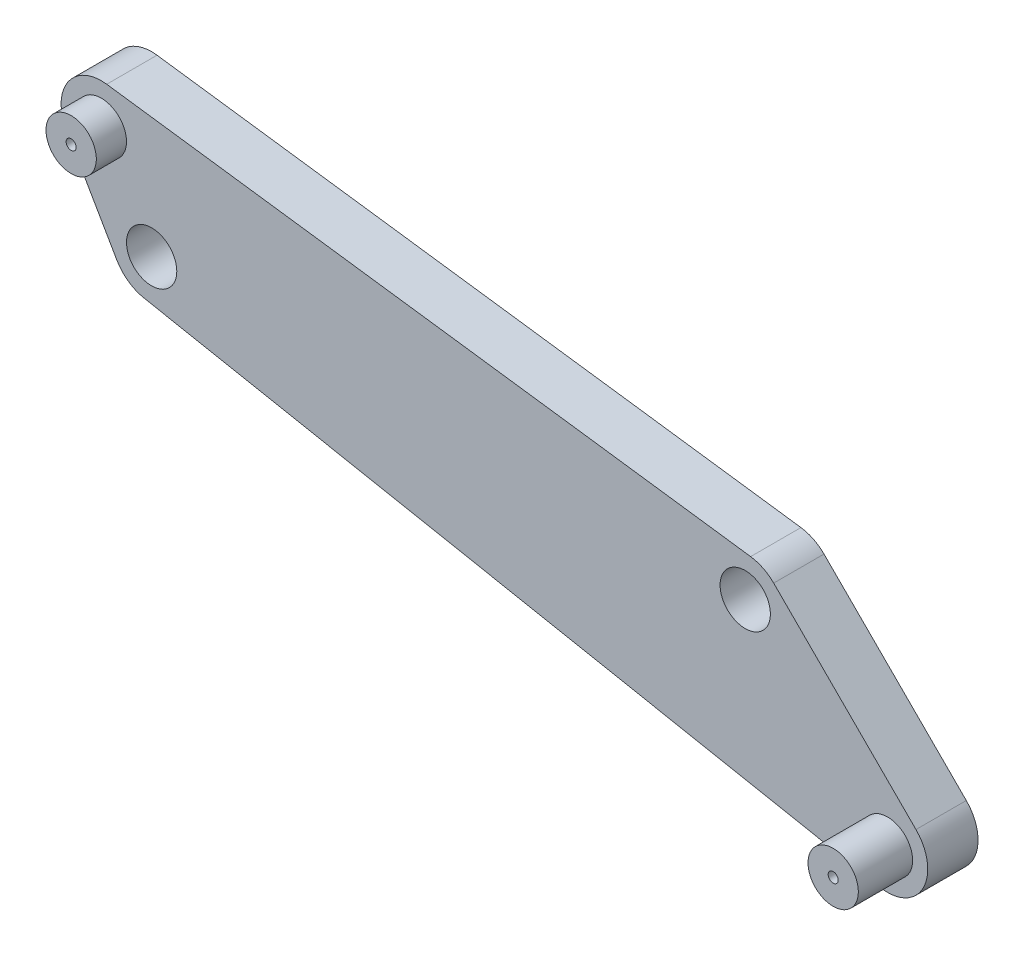
ISO-10303-21;
HEADER;
FILE_DESCRIPTION(('STEP AP214'),'2;1');
FILE_NAME('part.step','',(''),(''),'','','');
FILE_SCHEMA(('AUTOMOTIVE_DESIGN { 1 0 10303 214 1 1 1 1 }'));
ENDSEC;
DATA;
#1=APPLICATION_CONTEXT('core data for automotive mechanical design processes');
#2=APPLICATION_PROTOCOL_DEFINITION('international standard','automotive_design',2000,#1);
#3=PRODUCT_CONTEXT('',#1,'mechanical');
#4=PRODUCT('Part','Part','',(#3));
#5=PRODUCT_RELATED_PRODUCT_CATEGORY('part','',(#4));
#6=PRODUCT_DEFINITION_FORMATION('','',#4);
#7=PRODUCT_DEFINITION_CONTEXT('part definition',#1,'design');
#8=PRODUCT_DEFINITION('design','',#6,#7);
#9=PRODUCT_DEFINITION_SHAPE('','',#8);
#10=(LENGTH_UNIT() NAMED_UNIT(*) SI_UNIT(.MILLI.,.METRE.));
#11=(NAMED_UNIT(*) PLANE_ANGLE_UNIT() SI_UNIT($,.RADIAN.));
#12=(NAMED_UNIT(*) SI_UNIT($,.STERADIAN.) SOLID_ANGLE_UNIT());
#13=UNCERTAINTY_MEASURE_WITH_UNIT(LENGTH_MEASURE(1.E-05),#10,'distance_accuracy_value','');
#14=(GEOMETRIC_REPRESENTATION_CONTEXT(3) GLOBAL_UNCERTAINTY_ASSIGNED_CONTEXT((#13)) GLOBAL_UNIT_ASSIGNED_CONTEXT((#10,
#11,#12)) REPRESENTATION_CONTEXT('',''));
#15=CARTESIAN_POINT('',(0.,0.,0.));
#16=DIRECTION('',(0.,0.,1.));
#17=DIRECTION('',(1.,0.,0.));
#18=AXIS2_PLACEMENT_3D('',#15,#16,#17);
#19=CARTESIAN_POINT('',(-59.,0.,5.));
#20=DIRECTION('',(0.,0.,1.));
#21=DIRECTION('',(1.,0.,0.));
#22=AXIS2_PLACEMENT_3D('',#19,#20,#21);
#23=PLANE('',#22);
#24=CARTESIAN_POINT('',(0.,0.,5.));
#25=DIRECTION('',(0.,0.,1.));
#26=DIRECTION('',(1.,0.,0.));
#27=AXIS2_PLACEMENT_3D('',#24,#25,#26);
#28=CIRCLE('',#27,2.5);
#29=CARTESIAN_POINT('',(2.5,0.,5.));
#30=VERTEX_POINT('',#29);
#31=EDGE_CURVE('E188',#30,#30,#28,.T.);
#32=ORIENTED_EDGE('',*,*,#31,.F.);
#33=EDGE_LOOP('',(#32));
#34=FACE_BOUND('',#33,.T.);
#35=CARTESIAN_POINT('',(-59.,0.,5.));
#36=DIRECTION('',(0.,0.,1.));
#37=DIRECTION('',(1.,0.,0.));
#38=AXIS2_PLACEMENT_3D('',#35,#36,#37);
#39=CIRCLE('',#38,2.5);
#40=CARTESIAN_POINT('',(-56.5,0.,5.));
#41=VERTEX_POINT('',#40);
#42=EDGE_CURVE('E135',#41,#41,#39,.T.);
#43=ORIENTED_EDGE('',*,*,#42,.F.);
#44=EDGE_LOOP('',(#43));
#45=FACE_BOUND('',#44,.T.);
#46=CARTESIAN_POINT('',(-59.,0.,5.));
#47=DIRECTION('',(0.,0.,1.));
#48=DIRECTION('',(1.,0.,0.));
#49=AXIS2_PLACEMENT_3D('',#46,#47,#48);
#50=CIRCLE('',#49,4.00000000000001);
#51=CARTESIAN_POINT('',(-62.4641016151378,-2.00000000000001,5.));
#52=VERTEX_POINT('',#51);
#53=CARTESIAN_POINT('',(-59.7593419938109,-3.92726364488499,5.));
#54=VERTEX_POINT('',#53);
#55=EDGE_CURVE('E146',#52,#54,#50,.T.);
#56=ORIENTED_EDGE('',*,*,#55,.T.);
#57=DIRECTION('',(0.981815911221246,-0.189835498452724,0.));
#58=VECTOR('',#57,1.);
#59=CARTESIAN_POINT('',(13.3827936299201,-18.0693992686159,5.));
#60=LINE('',#59,#58);
#61=CARTESIAN_POINT('',(13.3827936299201,-18.0693992686159,5.));
#62=VERTEX_POINT('',#61);
#63=EDGE_CURVE('E94',#54,#62,#60,.T.);
#64=ORIENTED_EDGE('',*,*,#63,.T.);
#65=CARTESIAN_POINT('',(14.142135623731,-14.1421356237309,5.));
#66=DIRECTION('',(0.,0.,1.));
#67=DIRECTION('',(1.,0.,0.));
#68=AXIS2_PLACEMENT_3D('',#65,#66,#67);
#69=CIRCLE('',#68,4.);
#70=CARTESIAN_POINT('',(16.9705627484772,-11.3137084989847,5.));
#71=VERTEX_POINT('',#70);
#72=EDGE_CURVE('E161',#62,#71,#69,.T.);
#73=ORIENTED_EDGE('',*,*,#72,.T.);
#74=DIRECTION('',(-0.707106781186552,0.707106781186543,0.));
#75=VECTOR('',#74,1.);
#76=CARTESIAN_POINT('',(2.82842712474617,2.8284271247462,5.));
#77=LINE('',#76,#75);
#78=CARTESIAN_POINT('',(2.82842712474617,2.82842712474621,5.));
#79=VERTEX_POINT('',#78);
#80=EDGE_CURVE('E174',#71,#79,#77,.T.);
#81=ORIENTED_EDGE('',*,*,#80,.T.);
#82=CARTESIAN_POINT('',(0.,0.,5.));
#83=DIRECTION('',(0.,0.,1.));
#84=DIRECTION('',(1.,0.,0.));
#85=AXIS2_PLACEMENT_3D('',#82,#83,#84);
#86=CIRCLE('',#85,4.);
#87=CARTESIAN_POINT('',(0.536377470795685,3.96387426753458,5.));
#88=VERTEX_POINT('',#87);
#89=EDGE_CURVE('E113',#79,#88,#86,.T.);
#90=ORIENTED_EDGE('',*,*,#89,.T.);
#91=DIRECTION('',(-0.990968566883646,0.134094367698921,0.));
#92=VECTOR('',#91,1.);
#93=CARTESIAN_POINT('',(-63.4636225292043,12.624128305379,5.));
#94=LINE('',#93,#92);
#95=CARTESIAN_POINT('',(-63.4636225292043,12.624128305379,5.));
#96=VERTEX_POINT('',#95);
#97=EDGE_CURVE('E107',#88,#96,#94,.T.);
#98=ORIENTED_EDGE('',*,*,#97,.T.);
#99=CARTESIAN_POINT('',(-64.,8.66025403784439,5.));
#100=DIRECTION('',(0.,0.,1.));
#101=DIRECTION('',(1.,0.,0.));
#102=AXIS2_PLACEMENT_3D('',#99,#100,#101);
#103=CIRCLE('',#102,4.00000000000001);
#104=CARTESIAN_POINT('',(-67.4641016151378,6.66025403784439,5.));
#105=VERTEX_POINT('',#104);
#106=EDGE_CURVE('E111',#96,#105,#103,.T.);
#107=ORIENTED_EDGE('',*,*,#106,.T.);
#108=DIRECTION('',(0.499999999999999,-0.86602540378444,0.));
#109=VECTOR('',#108,1.);
#110=CARTESIAN_POINT('',(-62.4641016151378,-2.00000000000001,5.));
#111=LINE('',#110,#109);
#112=EDGE_CURVE('E51',#105,#52,#111,.T.);
#113=ORIENTED_EDGE('',*,*,#112,.T.);
#114=EDGE_LOOP('',(#56,#64,#73,#81,#90,#98,#107,#113));
#115=FACE_BOUND('',#114,.T.);
#116=CARTESIAN_POINT('',(-64.,8.66025403784439,5.));
#117=DIRECTION('',(0.,0.,1.));
#118=DIRECTION('',(1.,0.,0.));
#119=AXIS2_PLACEMENT_3D('',#116,#117,#118);
#120=CIRCLE('',#119,2.50000000000001);
#121=CARTESIAN_POINT('',(-61.5,8.66025403784439,5.));
#122=VERTEX_POINT('',#121);
#123=EDGE_CURVE('E183',#122,#122,#120,.T.);
#124=ORIENTED_EDGE('',*,*,#123,.F.);
#125=EDGE_LOOP('',(#124));
#126=FACE_BOUND('',#125,.T.);
#127=CARTESIAN_POINT('',(14.142135623731,-14.1421356237309,5.));
#128=DIRECTION('',(0.,0.,1.));
#129=DIRECTION('',(1.,0.,0.));
#130=AXIS2_PLACEMENT_3D('',#127,#128,#129);
#131=CIRCLE('',#130,2.5);
#132=CARTESIAN_POINT('',(16.642135623731,-14.1421356237309,5.));
#133=VERTEX_POINT('',#132);
#134=EDGE_CURVE('E192',#133,#133,#131,.T.);
#135=ORIENTED_EDGE('',*,*,#134,.F.);
#136=EDGE_LOOP('',(#135));
#137=FACE_BOUND('',#136,.T.);
#138=ADVANCED_FACE('F34',(#34,#45,#115,#126,#137),#23,.T.);
#139=CARTESIAN_POINT('',(-59.,0.,0.));
#140=DIRECTION('',(0.,0.,1.));
#141=DIRECTION('',(1.,0.,0.));
#142=AXIS2_PLACEMENT_3D('',#139,#140,#141);
#143=PLANE('',#142);
#144=CARTESIAN_POINT('',(-59.,0.,0.));
#145=DIRECTION('',(0.,0.,1.));
#146=DIRECTION('',(1.,0.,0.));
#147=AXIS2_PLACEMENT_3D('',#144,#145,#146);
#148=CIRCLE('',#147,4.00000000000001);
#149=CARTESIAN_POINT('',(-62.4641016151378,-2.00000000000001,0.));
#150=VERTEX_POINT('',#149);
#151=CARTESIAN_POINT('',(-59.7593419938109,-3.92726364488499,0.));
#152=VERTEX_POINT('',#151);
#153=EDGE_CURVE('E131',#150,#152,#148,.T.);
#154=ORIENTED_EDGE('',*,*,#153,.F.);
#155=DIRECTION('',(0.499999999999999,-0.86602540378444,0.));
#156=VECTOR('',#155,1.);
#157=CARTESIAN_POINT('',(-62.4641016151378,-2.00000000000001,0.));
#158=LINE('',#157,#156);
#159=CARTESIAN_POINT('',(-67.4641016151378,6.66025403784439,0.));
#160=VERTEX_POINT('',#159);
#161=EDGE_CURVE('E86',#160,#150,#158,.T.);
#162=ORIENTED_EDGE('',*,*,#161,.F.);
#163=CARTESIAN_POINT('',(-64.,8.66025403784439,0.));
#164=DIRECTION('',(0.,0.,1.));
#165=DIRECTION('',(1.,0.,0.));
#166=AXIS2_PLACEMENT_3D('',#163,#164,#165);
#167=CIRCLE('',#166,4.00000000000001);
#168=CARTESIAN_POINT('',(-63.4636225292043,12.624128305379,0.));
#169=VERTEX_POINT('',#168);
#170=EDGE_CURVE('E80',#169,#160,#167,.T.);
#171=ORIENTED_EDGE('',*,*,#170,.F.);
#172=DIRECTION('',(-0.990968566883646,0.134094367698921,0.));
#173=VECTOR('',#172,1.);
#174=CARTESIAN_POINT('',(-63.4636225292043,12.624128305379,0.));
#175=LINE('',#174,#173);
#176=CARTESIAN_POINT('',(0.536377470795685,3.96387426753458,0.));
#177=VERTEX_POINT('',#176);
#178=EDGE_CURVE('E121',#177,#169,#175,.T.);
#179=ORIENTED_EDGE('',*,*,#178,.F.);
#180=CARTESIAN_POINT('',(0.,0.,0.));
#181=DIRECTION('',(0.,0.,1.));
#182=DIRECTION('',(1.,0.,0.));
#183=AXIS2_PLACEMENT_3D('',#180,#181,#182);
#184=CIRCLE('',#183,4.);
#185=CARTESIAN_POINT('',(2.82842712474617,2.82842712474621,0.));
#186=VERTEX_POINT('',#185);
#187=EDGE_CURVE('E141',#186,#177,#184,.T.);
#188=ORIENTED_EDGE('',*,*,#187,.F.);
#189=DIRECTION('',(-0.707106781186552,0.707106781186543,0.));
#190=VECTOR('',#189,1.);
#191=CARTESIAN_POINT('',(2.82842712474617,2.8284271247462,0.));
#192=LINE('',#191,#190);
#193=CARTESIAN_POINT('',(16.9705627484772,-11.3137084989847,0.));
#194=VERTEX_POINT('',#193);
#195=EDGE_CURVE('E139',#194,#186,#192,.T.);
#196=ORIENTED_EDGE('',*,*,#195,.F.);
#197=CARTESIAN_POINT('',(14.142135623731,-14.1421356237309,0.));
#198=DIRECTION('',(0.,0.,1.));
#199=DIRECTION('',(1.,0.,0.));
#200=AXIS2_PLACEMENT_3D('',#197,#198,#199);
#201=CIRCLE('',#200,4.);
#202=CARTESIAN_POINT('',(13.3827936299201,-18.0693992686159,0.));
#203=VERTEX_POINT('',#202);
#204=EDGE_CURVE('E137',#203,#194,#201,.T.);
#205=ORIENTED_EDGE('',*,*,#204,.F.);
#206=DIRECTION('',(0.981815911221246,-0.189835498452724,0.));
#207=VECTOR('',#206,1.);
#208=CARTESIAN_POINT('',(13.3827936299201,-18.0693992686159,0.));
#209=LINE('',#208,#207);
#210=EDGE_CURVE('E134',#152,#203,#209,.T.);
#211=ORIENTED_EDGE('',*,*,#210,.F.);
#212=EDGE_LOOP('',(#154,#162,#171,#179,#188,#196,#205,#211));
#213=FACE_BOUND('',#212,.T.);
#214=CARTESIAN_POINT('',(-59.,0.,0.));
#215=DIRECTION('',(0.,0.,1.));
#216=DIRECTION('',(1.,0.,0.));
#217=AXIS2_PLACEMENT_3D('',#214,#215,#216);
#218=CIRCLE('',#217,2.5);
#219=CARTESIAN_POINT('',(-56.5,0.,0.));
#220=VERTEX_POINT('',#219);
#221=EDGE_CURVE('E180',#220,#220,#218,.T.);
#222=ORIENTED_EDGE('',*,*,#221,.T.);
#223=EDGE_LOOP('',(#222));
#224=FACE_BOUND('',#223,.T.);
#225=CARTESIAN_POINT('',(0.,0.,0.));
#226=DIRECTION('',(0.,0.,1.));
#227=DIRECTION('',(1.,0.,0.));
#228=AXIS2_PLACEMENT_3D('',#225,#226,#227);
#229=CIRCLE('',#228,2.5);
#230=CARTESIAN_POINT('',(2.5,0.,0.));
#231=VERTEX_POINT('',#230);
#232=EDGE_CURVE('E189',#231,#231,#229,.T.);
#233=ORIENTED_EDGE('',*,*,#232,.T.);
#234=EDGE_LOOP('',(#233));
#235=FACE_BOUND('',#234,.T.);
#236=CARTESIAN_POINT('',(-64.,8.66025403784439,0.));
#237=DIRECTION('',(0.,0.,-1.));
#238=DIRECTION('',(-1.,0.,0.));
#239=AXIS2_PLACEMENT_3D('',#236,#237,#238);
#240=CIRCLE('',#239,0.499999999999999);
#241=CARTESIAN_POINT('',(-64.5,8.66025403784439,0.));
#242=VERTEX_POINT('',#241);
#243=EDGE_CURVE('E201',#242,#242,#240,.T.);
#244=ORIENTED_EDGE('',*,*,#243,.F.);
#245=EDGE_LOOP('',(#244));
#246=FACE_BOUND('',#245,.T.);
#247=CARTESIAN_POINT('',(14.142135623731,-14.1421356237309,0.));
#248=DIRECTION('',(0.,0.,-1.));
#249=DIRECTION('',(-1.,0.,0.));
#250=AXIS2_PLACEMENT_3D('',#247,#248,#249);
#251=CIRCLE('',#250,0.500000000000001);
#252=CARTESIAN_POINT('',(13.642135623731,-14.1421356237309,0.));
#253=VERTEX_POINT('',#252);
#254=EDGE_CURVE('E204',#253,#253,#251,.T.);
#255=ORIENTED_EDGE('',*,*,#254,.F.);
#256=EDGE_LOOP('',(#255));
#257=FACE_BOUND('',#256,.T.);
#258=ADVANCED_FACE('F165',(#213,#224,#235,#246,#257),#143,.F.);
#259=CARTESIAN_POINT('',(-59.,0.,5.));
#260=DIRECTION('',(0.,0.,-1.));
#261=DIRECTION('',(-1.,0.,0.));
#262=AXIS2_PLACEMENT_3D('',#259,#260,#261);
#263=CYLINDRICAL_SURFACE('',#262,4.00000000000001);
#264=ORIENTED_EDGE('',*,*,#153,.T.);
#265=DIRECTION('',(0.,0.,-1.));
#266=VECTOR('',#265,1.);
#267=CARTESIAN_POINT('',(-59.7593419938109,-3.92726364488499,5.));
#268=LINE('',#267,#266);
#269=EDGE_CURVE('E11',#54,#152,#268,.T.);
#270=ORIENTED_EDGE('',*,*,#269,.F.);
#271=ORIENTED_EDGE('',*,*,#55,.F.);
#272=DIRECTION('',(0.,0.,-1.));
#273=VECTOR('',#272,1.);
#274=CARTESIAN_POINT('',(-62.4641016151378,-2.00000000000001,5.));
#275=LINE('',#274,#273);
#276=EDGE_CURVE('E127',#52,#150,#275,.T.);
#277=ORIENTED_EDGE('',*,*,#276,.T.);
#278=EDGE_LOOP('',(#264,#270,#271,#277));
#279=FACE_BOUND('',#278,.T.);
#280=ADVANCED_FACE('F36',(#279),#263,.T.);
#281=CARTESIAN_POINT('',(13.3827936299201,-18.0693992686159,5.));
#282=DIRECTION('',(0.189835498452724,0.981815911221246,0.));
#283=DIRECTION('',(-0.981815911221246,0.189835498452724,0.));
#284=AXIS2_PLACEMENT_3D('',#281,#282,#283);
#285=PLANE('',#284);
#286=ORIENTED_EDGE('',*,*,#210,.T.);
#287=DIRECTION('',(0.,0.,-1.));
#288=VECTOR('',#287,1.);
#289=CARTESIAN_POINT('',(13.3827936299201,-18.0693992686159,5.));
#290=LINE('',#289,#288);
#291=EDGE_CURVE('E43',#62,#203,#290,.T.);
#292=ORIENTED_EDGE('',*,*,#291,.F.);
#293=ORIENTED_EDGE('',*,*,#63,.F.);
#294=ORIENTED_EDGE('',*,*,#269,.T.);
#295=EDGE_LOOP('',(#286,#292,#293,#294));
#296=FACE_BOUND('',#295,.T.);
#297=ADVANCED_FACE('F253',(#296),#285,.F.);
#298=CARTESIAN_POINT('',(14.142135623731,-14.1421356237309,5.));
#299=DIRECTION('',(0.,0.,-1.));
#300=DIRECTION('',(-1.,0.,0.));
#301=AXIS2_PLACEMENT_3D('',#298,#299,#300);
#302=CYLINDRICAL_SURFACE('',#301,4.);
#303=ORIENTED_EDGE('',*,*,#204,.T.);
#304=DIRECTION('',(0.,0.,-1.));
#305=VECTOR('',#304,1.);
#306=CARTESIAN_POINT('',(16.9705627484772,-11.3137084989847,5.));
#307=LINE('',#306,#305);
#308=EDGE_CURVE('E153',#71,#194,#307,.T.);
#309=ORIENTED_EDGE('',*,*,#308,.F.);
#310=ORIENTED_EDGE('',*,*,#72,.F.);
#311=ORIENTED_EDGE('',*,*,#291,.T.);
#312=EDGE_LOOP('',(#303,#309,#310,#311));
#313=FACE_BOUND('',#312,.T.);
#314=ADVANCED_FACE('F159',(#313),#302,.T.);
#315=CARTESIAN_POINT('',(2.82842712474617,2.8284271247462,5.));
#316=DIRECTION('',(-0.707106781186543,-0.707106781186552,0.));
#317=DIRECTION('',(0.707106781186552,-0.707106781186543,0.));
#318=AXIS2_PLACEMENT_3D('',#315,#316,#317);
#319=PLANE('',#318);
#320=ORIENTED_EDGE('',*,*,#195,.T.);
#321=DIRECTION('',(0.,0.,-1.));
#322=VECTOR('',#321,1.);
#323=CARTESIAN_POINT('',(2.82842712474617,2.82842712474621,5.));
#324=LINE('',#323,#322);
#325=EDGE_CURVE('E150',#79,#186,#324,.T.);
#326=ORIENTED_EDGE('',*,*,#325,.F.);
#327=ORIENTED_EDGE('',*,*,#80,.F.);
#328=ORIENTED_EDGE('',*,*,#308,.T.);
#329=EDGE_LOOP('',(#320,#326,#327,#328));
#330=FACE_BOUND('',#329,.T.);
#331=ADVANCED_FACE('F170',(#330),#319,.F.);
#332=CARTESIAN_POINT('',(0.,0.,5.));
#333=DIRECTION('',(0.,0.,-1.));
#334=DIRECTION('',(-1.,0.,0.));
#335=AXIS2_PLACEMENT_3D('',#332,#333,#334);
#336=CYLINDRICAL_SURFACE('',#335,4.);
#337=ORIENTED_EDGE('',*,*,#187,.T.);
#338=DIRECTION('',(0.,0.,-1.));
#339=VECTOR('',#338,1.);
#340=CARTESIAN_POINT('',(0.536377470795685,3.96387426753458,5.));
#341=LINE('',#340,#339);
#342=EDGE_CURVE('E122',#88,#177,#341,.T.);
#343=ORIENTED_EDGE('',*,*,#342,.F.);
#344=ORIENTED_EDGE('',*,*,#89,.F.);
#345=ORIENTED_EDGE('',*,*,#325,.T.);
#346=EDGE_LOOP('',(#337,#343,#344,#345));
#347=FACE_BOUND('',#346,.T.);
#348=ADVANCED_FACE('F173',(#347),#336,.T.);
#349=CARTESIAN_POINT('',(-63.4636225292043,12.624128305379,5.));
#350=DIRECTION('',(-0.134094367698921,-0.990968566883646,0.));
#351=DIRECTION('',(0.990968566883646,-0.134094367698921,0.));
#352=AXIS2_PLACEMENT_3D('',#349,#350,#351);
#353=PLANE('',#352);
#354=ORIENTED_EDGE('',*,*,#178,.T.);
#355=DIRECTION('',(0.,0.,-1.));
#356=VECTOR('',#355,1.);
#357=CARTESIAN_POINT('',(-63.4636225292043,12.624128305379,5.));
#358=LINE('',#357,#356);
#359=EDGE_CURVE('E118',#96,#169,#358,.T.);
#360=ORIENTED_EDGE('',*,*,#359,.F.);
#361=ORIENTED_EDGE('',*,*,#97,.F.);
#362=ORIENTED_EDGE('',*,*,#342,.T.);
#363=EDGE_LOOP('',(#354,#360,#361,#362));
#364=FACE_BOUND('',#363,.T.);
#365=ADVANCED_FACE('F119',(#364),#353,.F.);
#366=CARTESIAN_POINT('',(-64.,8.66025403784439,5.));
#367=DIRECTION('',(0.,0.,-1.));
#368=DIRECTION('',(-1.,0.,0.));
#369=AXIS2_PLACEMENT_3D('',#366,#367,#368);
#370=CYLINDRICAL_SURFACE('',#369,4.00000000000001);
#371=ORIENTED_EDGE('',*,*,#170,.T.);
#372=DIRECTION('',(0.,0.,-1.));
#373=VECTOR('',#372,1.);
#374=CARTESIAN_POINT('',(-67.4641016151378,6.66025403784439,5.));
#375=LINE('',#374,#373);
#376=EDGE_CURVE('E123',#105,#160,#375,.T.);
#377=ORIENTED_EDGE('',*,*,#376,.F.);
#378=ORIENTED_EDGE('',*,*,#106,.F.);
#379=ORIENTED_EDGE('',*,*,#359,.T.);
#380=EDGE_LOOP('',(#371,#377,#378,#379));
#381=FACE_BOUND('',#380,.T.);
#382=ADVANCED_FACE('F125',(#381),#370,.T.);
#383=CARTESIAN_POINT('',(-62.4641016151378,-2.00000000000001,5.));
#384=DIRECTION('',(0.86602540378444,0.499999999999998,0.));
#385=DIRECTION('',(-0.499999999999998,0.86602540378444,0.));
#386=AXIS2_PLACEMENT_3D('',#383,#384,#385);
#387=PLANE('',#386);
#388=ORIENTED_EDGE('',*,*,#161,.T.);
#389=ORIENTED_EDGE('',*,*,#276,.F.);
#390=ORIENTED_EDGE('',*,*,#112,.F.);
#391=ORIENTED_EDGE('',*,*,#376,.T.);
#392=EDGE_LOOP('',(#388,#389,#390,#391));
#393=FACE_BOUND('',#392,.T.);
#394=ADVANCED_FACE('F241',(#393),#387,.F.);
#395=CARTESIAN_POINT('',(-59.,0.,5.));
#396=DIRECTION('',(0.,0.,-1.));
#397=DIRECTION('',(-1.,0.,0.));
#398=AXIS2_PLACEMENT_3D('',#395,#396,#397);
#399=CYLINDRICAL_SURFACE('',#398,2.5);
#400=ORIENTED_EDGE('',*,*,#42,.T.);
#401=EDGE_LOOP('',(#400));
#402=FACE_BOUND('',#401,.T.);
#403=ORIENTED_EDGE('',*,*,#221,.F.);
#404=EDGE_LOOP('',(#403));
#405=FACE_BOUND('',#404,.T.);
#406=ADVANCED_FACE('F238',(#402,#405),#399,.F.);
#407=CARTESIAN_POINT('',(0.,0.,5.));
#408=DIRECTION('',(0.,0.,-1.));
#409=DIRECTION('',(-1.,0.,0.));
#410=AXIS2_PLACEMENT_3D('',#407,#408,#409);
#411=CYLINDRICAL_SURFACE('',#410,2.5);
#412=ORIENTED_EDGE('',*,*,#31,.T.);
#413=EDGE_LOOP('',(#412));
#414=FACE_BOUND('',#413,.T.);
#415=ORIENTED_EDGE('',*,*,#232,.F.);
#416=EDGE_LOOP('',(#415));
#417=FACE_BOUND('',#416,.T.);
#418=ADVANCED_FACE('F275',(#414,#417),#411,.F.);
#419=CARTESIAN_POINT('',(-64.,8.66025403784439,8.));
#420=DIRECTION('',(0.,0.,-1.));
#421=DIRECTION('',(-1.,0.,0.));
#422=AXIS2_PLACEMENT_3D('',#419,#420,#421);
#423=CYLINDRICAL_SURFACE('',#422,2.50000000000001);
#424=ORIENTED_EDGE('',*,*,#123,.T.);
#425=EDGE_LOOP('',(#424));
#426=FACE_BOUND('',#425,.T.);
#427=CARTESIAN_POINT('',(-64.,8.66025403784439,8.));
#428=DIRECTION('',(0.,0.,-1.));
#429=DIRECTION('',(-1.,0.,0.));
#430=AXIS2_PLACEMENT_3D('',#427,#428,#429);
#431=CIRCLE('',#430,2.50000000000001);
#432=CARTESIAN_POINT('',(-66.5,8.66025403784439,8.));
#433=VERTEX_POINT('',#432);
#434=EDGE_CURVE('E197',#433,#433,#431,.T.);
#435=ORIENTED_EDGE('',*,*,#434,.T.);
#436=EDGE_LOOP('',(#435));
#437=FACE_BOUND('',#436,.T.);
#438=ADVANCED_FACE('F280',(#426,#437),#423,.T.);
#439=CARTESIAN_POINT('',(-64.,8.66025403784439,8.));
#440=DIRECTION('',(0.,0.,-1.));
#441=DIRECTION('',(-1.,0.,0.));
#442=AXIS2_PLACEMENT_3D('',#439,#440,#441);
#443=PLANE('',#442);
#444=CARTESIAN_POINT('',(-64.,8.66025403784439,8.));
#445=DIRECTION('',(0.,0.,-1.));
#446=DIRECTION('',(-1.,0.,0.));
#447=AXIS2_PLACEMENT_3D('',#444,#445,#446);
#448=CIRCLE('',#447,0.499999999999999);
#449=CARTESIAN_POINT('',(-64.5,8.66025403784439,8.));
#450=VERTEX_POINT('',#449);
#451=EDGE_CURVE('E200',#450,#450,#448,.T.);
#452=ORIENTED_EDGE('',*,*,#451,.T.);
#453=EDGE_LOOP('',(#452));
#454=FACE_BOUND('',#453,.T.);
#455=ORIENTED_EDGE('',*,*,#434,.F.);
#456=EDGE_LOOP('',(#455));
#457=FACE_BOUND('',#456,.T.);
#458=ADVANCED_FACE('F284',(#454,#457),#443,.F.);
#459=CARTESIAN_POINT('',(-64.,8.66025403784439,8.));
#460=DIRECTION('',(0.,0.,-1.));
#461=DIRECTION('',(-1.,0.,0.));
#462=AXIS2_PLACEMENT_3D('',#459,#460,#461);
#463=CYLINDRICAL_SURFACE('',#462,0.499999999999999);
#464=ORIENTED_EDGE('',*,*,#451,.F.);
#465=EDGE_LOOP('',(#464));
#466=FACE_BOUND('',#465,.T.);
#467=ORIENTED_EDGE('',*,*,#243,.T.);
#468=EDGE_LOOP('',(#467));
#469=FACE_BOUND('',#468,.T.);
#470=ADVANCED_FACE('F294',(#466,#469),#463,.F.);
#471=CARTESIAN_POINT('',(14.142135623731,-14.1421356237309,8.));
#472=DIRECTION('',(0.,0.,-1.));
#473=DIRECTION('',(-1.,0.,0.));
#474=AXIS2_PLACEMENT_3D('',#471,#472,#473);
#475=CYLINDRICAL_SURFACE('',#474,2.5);
#476=ORIENTED_EDGE('',*,*,#134,.T.);
#477=EDGE_LOOP('',(#476));
#478=FACE_BOUND('',#477,.T.);
#479=CARTESIAN_POINT('',(14.142135623731,-14.1421356237309,10.4));
#480=DIRECTION('',(0.,0.,1.));
#481=DIRECTION('',(1.,0.,0.));
#482=AXIS2_PLACEMENT_3D('',#479,#480,#481);
#483=CIRCLE('',#482,2.5);
#484=CARTESIAN_POINT('',(16.642135623731,-14.1421356237309,10.4));
#485=VERTEX_POINT('',#484);
#486=EDGE_CURVE('E209',#485,#485,#483,.T.);
#487=ORIENTED_EDGE('',*,*,#486,.F.);
#488=EDGE_LOOP('',(#487));
#489=FACE_BOUND('',#488,.T.);
#490=ADVANCED_FACE('F225',(#478,#489),#475,.T.);
#491=CARTESIAN_POINT('',(14.142135623731,-14.1421356237309,8.));
#492=DIRECTION('',(0.,0.,-1.));
#493=DIRECTION('',(-1.,0.,0.));
#494=AXIS2_PLACEMENT_3D('',#491,#492,#493);
#495=CYLINDRICAL_SURFACE('',#494,0.500000000000001);
#496=ORIENTED_EDGE('',*,*,#254,.T.);
#497=EDGE_LOOP('',(#496));
#498=FACE_BOUND('',#497,.T.);
#499=CARTESIAN_POINT('',(14.142135623731,-14.1421356237309,10.4));
#500=DIRECTION('',(0.,0.,1.));
#501=DIRECTION('',(1.,0.,0.));
#502=AXIS2_PLACEMENT_3D('',#499,#500,#501);
#503=CIRCLE('',#502,0.500000000000001);
#504=CARTESIAN_POINT('',(14.642135623731,-14.1421356237309,10.4));
#505=VERTEX_POINT('',#504);
#506=EDGE_CURVE('E212',#505,#505,#503,.T.);
#507=ORIENTED_EDGE('',*,*,#506,.T.);
#508=EDGE_LOOP('',(#507));
#509=FACE_BOUND('',#508,.T.);
#510=ADVANCED_FACE('F216',(#498,#509),#495,.F.);
#511=CARTESIAN_POINT('',(14.142135623731,-14.1421356237309,10.4));
#512=DIRECTION('',(0.,0.,1.));
#513=DIRECTION('',(1.,0.,0.));
#514=AXIS2_PLACEMENT_3D('',#511,#512,#513);
#515=PLANE('',#514);
#516=ORIENTED_EDGE('',*,*,#486,.T.);
#517=EDGE_LOOP('',(#516));
#518=FACE_BOUND('',#517,.T.);
#519=ORIENTED_EDGE('',*,*,#506,.F.);
#520=EDGE_LOOP('',(#519));
#521=FACE_BOUND('',#520,.T.);
#522=ADVANCED_FACE('F218',(#518,#521),#515,.T.);
#523=CLOSED_SHELL('',(#138,#258,#280,#297,#314,#331,#348,#365,#382,#394,#406,#418,#438,#458,
#470,#490,#510,#522));
#524=MANIFOLD_SOLID_BREP('B2',#523);
#525=ADVANCED_BREP_SHAPE_REPRESENTATION('',(#18,#524),#14);
#526=SHAPE_DEFINITION_REPRESENTATION(#9,#525);
ENDSEC;
END-ISO-10303-21;
